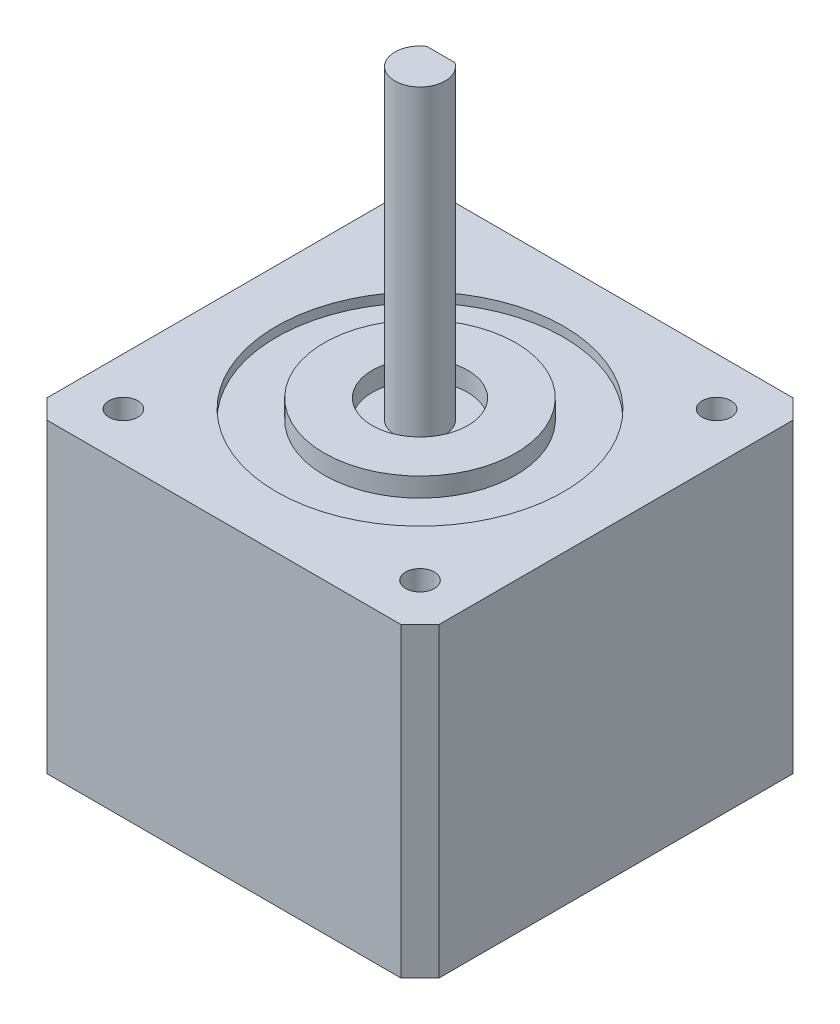
ISO-10303-21;
HEADER;
FILE_DESCRIPTION(('STEP AP214'),'2;1');
FILE_NAME('part.step','',(''),(''),'','','');
FILE_SCHEMA(('AUTOMOTIVE_DESIGN { 1 0 10303 214 1 1 1 1 }'));
ENDSEC;
DATA;
#1=APPLICATION_CONTEXT('core data for automotive mechanical design processes');
#2=APPLICATION_PROTOCOL_DEFINITION('international standard','automotive_design',2000,#1);
#3=PRODUCT_CONTEXT('',#1,'mechanical');
#4=PRODUCT('Part','Part','',(#3));
#5=PRODUCT_RELATED_PRODUCT_CATEGORY('part','',(#4));
#6=PRODUCT_DEFINITION_FORMATION('','',#4);
#7=PRODUCT_DEFINITION_CONTEXT('part definition',#1,'design');
#8=PRODUCT_DEFINITION('design','',#6,#7);
#9=PRODUCT_DEFINITION_SHAPE('','',#8);
#10=(LENGTH_UNIT() NAMED_UNIT(*) SI_UNIT(.MILLI.,.METRE.));
#11=(NAMED_UNIT(*) PLANE_ANGLE_UNIT() SI_UNIT($,.RADIAN.));
#12=(NAMED_UNIT(*) SI_UNIT($,.STERADIAN.) SOLID_ANGLE_UNIT());
#13=UNCERTAINTY_MEASURE_WITH_UNIT(LENGTH_MEASURE(1.E-05),#10,'distance_accuracy_value','');
#14=(GEOMETRIC_REPRESENTATION_CONTEXT(3) GLOBAL_UNCERTAINTY_ASSIGNED_CONTEXT((#13)) GLOBAL_UNIT_ASSIGNED_CONTEXT((#10,
#11,#12)) REPRESENTATION_CONTEXT('',''));
#15=CARTESIAN_POINT('',(0.,0.,0.));
#16=DIRECTION('',(0.,0.,1.));
#17=DIRECTION('',(1.,0.,0.));
#18=AXIS2_PLACEMENT_3D('',#15,#16,#17);
#19=CARTESIAN_POINT('',(0.,31.,0.));
#20=DIRECTION('',(0.,1.,0.));
#21=DIRECTION('',(0.,0.,1.));
#22=AXIS2_PLACEMENT_3D('',#19,#20,#21);
#23=PLANE('',#22);
#24=CARTESIAN_POINT('',(0.,31.,0.));
#25=DIRECTION('',(0.,1.,0.));
#26=DIRECTION('',(0.,0.,1.));
#27=AXIS2_PLACEMENT_3D('',#24,#25,#26);
#28=CIRCLE('',#27,5.);
#29=CARTESIAN_POINT('',(0.,31.,5.));
#30=VERTEX_POINT('',#29);
#31=EDGE_CURVE('E11',#30,#30,#28,.F.);
#32=ORIENTED_EDGE('',*,*,#31,.F.);
#33=EDGE_LOOP('',(#32));
#34=FACE_BOUND('',#33,.T.);
#35=DIRECTION('',(-1.,0.,0.));
#36=VECTOR('',#35,1.);
#37=CARTESIAN_POINT('',(-1.47098416147173,31.,-2.17535911633604));
#38=LINE('',#37,#36);
#39=CARTESIAN_POINT('',(1.47098416147173,31.,-2.17535911633604));
#40=VERTEX_POINT('',#39);
#41=CARTESIAN_POINT('',(-1.47098416147173,31.,-2.17535911633604));
#42=VERTEX_POINT('',#41);
#43=EDGE_CURVE('E214',#40,#42,#38,.T.);
#44=ORIENTED_EDGE('',*,*,#43,.F.);
#45=CARTESIAN_POINT('',(0.,31.,0.));
#46=DIRECTION('',(0.,1.,0.));
#47=DIRECTION('',(0.,0.,1.));
#48=AXIS2_PLACEMENT_3D('',#45,#46,#47);
#49=CIRCLE('',#48,2.62602012336673);
#50=EDGE_CURVE('E47',#42,#40,#49,.T.);
#51=ORIENTED_EDGE('',*,*,#50,.F.);
#52=EDGE_LOOP('',(#44,#51));
#53=FACE_BOUND('',#52,.T.);
#54=ADVANCED_FACE('F32',(#34,#53),#23,.T.);
#55=CARTESIAN_POINT('',(0.,31.,0.));
#56=DIRECTION('',(0.,1.,0.));
#57=DIRECTION('',(0.,0.,1.));
#58=AXIS2_PLACEMENT_3D('',#55,#56,#57);
#59=CIRCLE('',#58,15.);
#60=CARTESIAN_POINT('',(0.,31.,15.));
#61=VERTEX_POINT('',#60);
#62=EDGE_CURVE('E146',#61,#61,#59,.T.);
#63=ORIENTED_EDGE('',*,*,#62,.T.);
#64=EDGE_LOOP('',(#63));
#65=FACE_BOUND('',#64,.T.);
#66=CARTESIAN_POINT('',(0.,31.,0.));
#67=DIRECTION('',(0.,1.,0.));
#68=DIRECTION('',(0.,0.,1.));
#69=AXIS2_PLACEMENT_3D('',#66,#67,#68);
#70=CIRCLE('',#69,10.);
#71=CARTESIAN_POINT('',(0.,31.,10.));
#72=VERTEX_POINT('',#71);
#73=EDGE_CURVE('E201',#72,#72,#70,.T.);
#74=ORIENTED_EDGE('',*,*,#73,.F.);
#75=EDGE_LOOP('',(#74));
#76=FACE_BOUND('',#75,.T.);
#77=ADVANCED_FACE('F278',(#65,#76),#23,.T.);
#78=CARTESIAN_POINT('',(-18.5,32.,-20.5));
#79=DIRECTION('',(0.,0.,1.));
#80=DIRECTION('',(1.,0.,0.));
#81=AXIS2_PLACEMENT_3D('',#78,#79,#80);
#82=PLANE('',#81);
#83=DIRECTION('',(-1.,0.,0.));
#84=VECTOR('',#83,1.);
#85=CARTESIAN_POINT('',(-18.5,0.,-20.5));
#86=LINE('',#85,#84);
#87=CARTESIAN_POINT('',(18.5,0.,-20.5));
#88=VERTEX_POINT('',#87);
#89=CARTESIAN_POINT('',(-18.5,0.,-20.5));
#90=VERTEX_POINT('',#89);
#91=EDGE_CURVE('E142',#88,#90,#86,.T.);
#92=ORIENTED_EDGE('',*,*,#91,.T.);
#93=DIRECTION('',(0.,-1.,0.));
#94=VECTOR('',#93,1.);
#95=CARTESIAN_POINT('',(-18.5,32.,-20.5));
#96=LINE('',#95,#94);
#97=CARTESIAN_POINT('',(-18.5,32.,-20.5));
#98=VERTEX_POINT('',#97);
#99=EDGE_CURVE('E40',#98,#90,#96,.T.);
#100=ORIENTED_EDGE('',*,*,#99,.F.);
#101=DIRECTION('',(-1.,0.,0.));
#102=VECTOR('',#101,1.);
#103=CARTESIAN_POINT('',(-18.5,32.,-20.5));
#104=LINE('',#103,#102);
#105=CARTESIAN_POINT('',(18.5,32.,-20.5));
#106=VERTEX_POINT('',#105);
#107=EDGE_CURVE('E158',#106,#98,#104,.T.);
#108=ORIENTED_EDGE('',*,*,#107,.F.);
#109=DIRECTION('',(0.,-1.,0.));
#110=VECTOR('',#109,1.);
#111=CARTESIAN_POINT('',(18.5,32.,-20.5));
#112=LINE('',#111,#110);
#113=EDGE_CURVE('E138',#106,#88,#112,.T.);
#114=ORIENTED_EDGE('',*,*,#113,.T.);
#115=EDGE_LOOP('',(#92,#100,#108,#114));
#116=FACE_BOUND('',#115,.T.);
#117=ADVANCED_FACE('F34',(#116),#82,.F.);
#118=CARTESIAN_POINT('',(-20.5,32.,-18.5));
#119=DIRECTION('',(0.707106781186547,0.,0.707106781186548));
#120=DIRECTION('',(0.707106781186548,0.,-0.707106781186547));
#121=AXIS2_PLACEMENT_3D('',#118,#119,#120);
#122=PLANE('',#121);
#123=DIRECTION('',(-0.707106781186548,0.,0.707106781186547));
#124=VECTOR('',#123,1.);
#125=CARTESIAN_POINT('',(-20.5,0.,-18.5));
#126=LINE('',#125,#124);
#127=CARTESIAN_POINT('',(-20.5,0.,-18.5));
#128=VERTEX_POINT('',#127);
#129=EDGE_CURVE('E145',#90,#128,#126,.T.);
#130=ORIENTED_EDGE('',*,*,#129,.T.);
#131=DIRECTION('',(0.,-1.,0.));
#132=VECTOR('',#131,1.);
#133=CARTESIAN_POINT('',(-20.5,32.,-18.5));
#134=LINE('',#133,#132);
#135=CARTESIAN_POINT('',(-20.5,32.,-18.5));
#136=VERTEX_POINT('',#135);
#137=EDGE_CURVE('E168',#136,#128,#134,.T.);
#138=ORIENTED_EDGE('',*,*,#137,.F.);
#139=DIRECTION('',(-0.707106781186548,0.,0.707106781186547));
#140=VECTOR('',#139,1.);
#141=CARTESIAN_POINT('',(-20.5,32.,-18.5));
#142=LINE('',#141,#140);
#143=EDGE_CURVE('E98',#98,#136,#142,.T.);
#144=ORIENTED_EDGE('',*,*,#143,.F.);
#145=ORIENTED_EDGE('',*,*,#99,.T.);
#146=EDGE_LOOP('',(#130,#138,#144,#145));
#147=FACE_BOUND('',#146,.T.);
#148=ADVANCED_FACE('F171',(#147),#122,.F.);
#149=CARTESIAN_POINT('',(-20.5,32.,18.5));
#150=DIRECTION('',(1.,0.,0.));
#151=DIRECTION('',(0.,0.,-1.));
#152=AXIS2_PLACEMENT_3D('',#149,#150,#151);
#153=PLANE('',#152);
#154=DIRECTION('',(0.,0.,1.));
#155=VECTOR('',#154,1.);
#156=CARTESIAN_POINT('',(-20.5,0.,18.5));
#157=LINE('',#156,#155);
#158=CARTESIAN_POINT('',(-20.5,0.,18.5));
#159=VERTEX_POINT('',#158);
#160=EDGE_CURVE('E148',#128,#159,#157,.T.);
#161=ORIENTED_EDGE('',*,*,#160,.T.);
#162=DIRECTION('',(0.,-1.,0.));
#163=VECTOR('',#162,1.);
#164=CARTESIAN_POINT('',(-20.5,32.,18.5));
#165=LINE('',#164,#163);
#166=CARTESIAN_POINT('',(-20.5,32.,18.5));
#167=VERTEX_POINT('',#166);
#168=EDGE_CURVE('E165',#167,#159,#165,.T.);
#169=ORIENTED_EDGE('',*,*,#168,.F.);
#170=DIRECTION('',(0.,0.,1.));
#171=VECTOR('',#170,1.);
#172=CARTESIAN_POINT('',(-20.5,32.,18.5));
#173=LINE('',#172,#171);
#174=EDGE_CURVE('E189',#136,#167,#173,.T.);
#175=ORIENTED_EDGE('',*,*,#174,.F.);
#176=ORIENTED_EDGE('',*,*,#137,.T.);
#177=EDGE_LOOP('',(#161,#169,#175,#176));
#178=FACE_BOUND('',#177,.T.);
#179=ADVANCED_FACE('F182',(#178),#153,.F.);
#180=CARTESIAN_POINT('',(-18.5,32.,20.5));
#181=DIRECTION('',(0.707106781186547,0.,-0.707106781186548));
#182=DIRECTION('',(-0.707106781186548,0.,-0.707106781186547));
#183=AXIS2_PLACEMENT_3D('',#180,#181,#182);
#184=PLANE('',#183);
#185=DIRECTION('',(0.707106781186548,0.,0.707106781186547));
#186=VECTOR('',#185,1.);
#187=CARTESIAN_POINT('',(-18.5,0.,20.5));
#188=LINE('',#187,#186);
#189=CARTESIAN_POINT('',(-18.5,0.,20.5));
#190=VERTEX_POINT('',#189);
#191=EDGE_CURVE('E150',#159,#190,#188,.T.);
#192=ORIENTED_EDGE('',*,*,#191,.T.);
#193=DIRECTION('',(0.,-1.,0.));
#194=VECTOR('',#193,1.);
#195=CARTESIAN_POINT('',(-18.5,32.,20.5));
#196=LINE('',#195,#194);
#197=CARTESIAN_POINT('',(-18.5,32.,20.5));
#198=VERTEX_POINT('',#197);
#199=EDGE_CURVE('E162',#198,#190,#196,.T.);
#200=ORIENTED_EDGE('',*,*,#199,.F.);
#201=DIRECTION('',(0.707106781186548,0.,0.707106781186547));
#202=VECTOR('',#201,1.);
#203=CARTESIAN_POINT('',(-18.5,32.,20.5));
#204=LINE('',#203,#202);
#205=EDGE_CURVE('E188',#167,#198,#204,.T.);
#206=ORIENTED_EDGE('',*,*,#205,.F.);
#207=ORIENTED_EDGE('',*,*,#168,.T.);
#208=EDGE_LOOP('',(#192,#200,#206,#207));
#209=FACE_BOUND('',#208,.T.);
#210=ADVANCED_FACE('F186',(#209),#184,.F.);
#211=CARTESIAN_POINT('',(-18.5,32.,20.5));
#212=DIRECTION('',(0.,0.,-1.));
#213=DIRECTION('',(-1.,0.,0.));
#214=AXIS2_PLACEMENT_3D('',#211,#212,#213);
#215=PLANE('',#214);
#216=DIRECTION('',(1.,0.,0.));
#217=VECTOR('',#216,1.);
#218=CARTESIAN_POINT('',(-18.5,0.,20.5));
#219=LINE('',#218,#217);
#220=CARTESIAN_POINT('',(18.5,0.,20.5));
#221=VERTEX_POINT('',#220);
#222=EDGE_CURVE('E152',#190,#221,#219,.T.);
#223=ORIENTED_EDGE('',*,*,#222,.T.);
#224=DIRECTION('',(0.,-1.,0.));
#225=VECTOR('',#224,1.);
#226=CARTESIAN_POINT('',(18.5,32.,20.5));
#227=LINE('',#226,#225);
#228=CARTESIAN_POINT('',(18.5,32.,20.5));
#229=VERTEX_POINT('',#228);
#230=EDGE_CURVE('E133',#229,#221,#227,.T.);
#231=ORIENTED_EDGE('',*,*,#230,.F.);
#232=DIRECTION('',(1.,0.,0.));
#233=VECTOR('',#232,1.);
#234=CARTESIAN_POINT('',(-18.5,32.,20.5));
#235=LINE('',#234,#233);
#236=EDGE_CURVE('E121',#198,#229,#235,.T.);
#237=ORIENTED_EDGE('',*,*,#236,.F.);
#238=ORIENTED_EDGE('',*,*,#199,.T.);
#239=EDGE_LOOP('',(#223,#231,#237,#238));
#240=FACE_BOUND('',#239,.T.);
#241=ADVANCED_FACE('F435',(#240),#215,.F.);
#242=CARTESIAN_POINT('',(18.5,32.,20.5));
#243=DIRECTION('',(-0.707106781186547,0.,-0.707106781186548));
#244=DIRECTION('',(-0.707106781186548,0.,0.707106781186547));
#245=AXIS2_PLACEMENT_3D('',#242,#243,#244);
#246=PLANE('',#245);
#247=DIRECTION('',(0.707106781186548,0.,-0.707106781186547));
#248=VECTOR('',#247,1.);
#249=CARTESIAN_POINT('',(18.5,0.,20.5));
#250=LINE('',#249,#248);
#251=CARTESIAN_POINT('',(20.5,0.,18.5));
#252=VERTEX_POINT('',#251);
#253=EDGE_CURVE('E130',#221,#252,#250,.T.);
#254=ORIENTED_EDGE('',*,*,#253,.T.);
#255=DIRECTION('',(0.,-1.,0.));
#256=VECTOR('',#255,1.);
#257=CARTESIAN_POINT('',(20.5,32.,18.5));
#258=LINE('',#257,#256);
#259=CARTESIAN_POINT('',(20.5,32.,18.5));
#260=VERTEX_POINT('',#259);
#261=EDGE_CURVE('E127',#260,#252,#258,.T.);
#262=ORIENTED_EDGE('',*,*,#261,.F.);
#263=DIRECTION('',(0.707106781186548,0.,-0.707106781186547));
#264=VECTOR('',#263,1.);
#265=CARTESIAN_POINT('',(18.5,32.,20.5));
#266=LINE('',#265,#264);
#267=EDGE_CURVE('E114',#229,#260,#266,.T.);
#268=ORIENTED_EDGE('',*,*,#267,.F.);
#269=ORIENTED_EDGE('',*,*,#230,.T.);
#270=EDGE_LOOP('',(#254,#262,#268,#269));
#271=FACE_BOUND('',#270,.T.);
#272=ADVANCED_FACE('F128',(#271),#246,.F.);
#273=CARTESIAN_POINT('',(20.5,32.,18.5));
#274=DIRECTION('',(-1.,0.,0.));
#275=DIRECTION('',(0.,0.,1.));
#276=AXIS2_PLACEMENT_3D('',#273,#274,#275);
#277=PLANE('',#276);
#278=DIRECTION('',(0.,0.,-1.));
#279=VECTOR('',#278,1.);
#280=CARTESIAN_POINT('',(20.5,0.,18.5));
#281=LINE('',#280,#279);
#282=CARTESIAN_POINT('',(20.5,0.,-18.5));
#283=VERTEX_POINT('',#282);
#284=EDGE_CURVE('E155',#252,#283,#281,.T.);
#285=ORIENTED_EDGE('',*,*,#284,.T.);
#286=DIRECTION('',(0.,-1.,0.));
#287=VECTOR('',#286,1.);
#288=CARTESIAN_POINT('',(20.5,32.,-18.5));
#289=LINE('',#288,#287);
#290=CARTESIAN_POINT('',(20.5,32.,-18.5));
#291=VERTEX_POINT('',#290);
#292=EDGE_CURVE('E134',#291,#283,#289,.T.);
#293=ORIENTED_EDGE('',*,*,#292,.F.);
#294=DIRECTION('',(0.,0.,-1.));
#295=VECTOR('',#294,1.);
#296=CARTESIAN_POINT('',(20.5,32.,18.5));
#297=LINE('',#296,#295);
#298=EDGE_CURVE('E118',#260,#291,#297,.T.);
#299=ORIENTED_EDGE('',*,*,#298,.F.);
#300=ORIENTED_EDGE('',*,*,#261,.T.);
#301=EDGE_LOOP('',(#285,#293,#299,#300));
#302=FACE_BOUND('',#301,.T.);
#303=ADVANCED_FACE('F136',(#302),#277,.F.);
#304=CARTESIAN_POINT('',(20.5,32.,-18.5));
#305=DIRECTION('',(-0.707106781186547,0.,0.707106781186547));
#306=DIRECTION('',(0.707106781186548,0.,0.707106781186548));
#307=AXIS2_PLACEMENT_3D('',#304,#305,#306);
#308=PLANE('',#307);
#309=DIRECTION('',(-0.707106781186547,0.,-0.707106781186547));
#310=VECTOR('',#309,1.);
#311=CARTESIAN_POINT('',(20.5,0.,-18.5));
#312=LINE('',#311,#310);
#313=EDGE_CURVE('E89',#283,#88,#312,.T.);
#314=ORIENTED_EDGE('',*,*,#313,.T.);
#315=ORIENTED_EDGE('',*,*,#113,.F.);
#316=DIRECTION('',(-0.707106781186547,0.,-0.707106781186547));
#317=VECTOR('',#316,1.);
#318=CARTESIAN_POINT('',(20.5,32.,-18.5));
#319=LINE('',#318,#317);
#320=EDGE_CURVE('E56',#291,#106,#319,.T.);
#321=ORIENTED_EDGE('',*,*,#320,.F.);
#322=ORIENTED_EDGE('',*,*,#292,.T.);
#323=EDGE_LOOP('',(#314,#315,#321,#322));
#324=FACE_BOUND('',#323,.T.);
#325=ADVANCED_FACE('F252',(#324),#308,.F.);
#326=CARTESIAN_POINT('',(20.5,32.,-20.5));
#327=DIRECTION('',(0.,1.,0.));
#328=DIRECTION('',(0.,0.,1.));
#329=AXIS2_PLACEMENT_3D('',#326,#327,#328);
#330=PLANE('',#329);
#331=CARTESIAN_POINT('',(15.5,32.,-15.5));
#332=DIRECTION('',(0.,1.,0.));
#333=DIRECTION('',(0.,0.,1.));
#334=AXIS2_PLACEMENT_3D('',#331,#332,#333);
#335=CIRCLE('',#334,1.5);
#336=CARTESIAN_POINT('',(15.5,32.,-14.));
#337=VERTEX_POINT('',#336);
#338=EDGE_CURVE('E244',#337,#337,#335,.T.);
#339=ORIENTED_EDGE('',*,*,#338,.F.);
#340=EDGE_LOOP('',(#339));
#341=FACE_BOUND('',#340,.T.);
#342=CARTESIAN_POINT('',(-15.5,32.,-15.5));
#343=DIRECTION('',(0.,1.,0.));
#344=DIRECTION('',(0.,0.,1.));
#345=AXIS2_PLACEMENT_3D('',#342,#343,#344);
#346=CIRCLE('',#345,1.5);
#347=CARTESIAN_POINT('',(-15.5,32.,-14.));
#348=VERTEX_POINT('',#347);
#349=EDGE_CURVE('E238',#348,#348,#346,.T.);
#350=ORIENTED_EDGE('',*,*,#349,.F.);
#351=EDGE_LOOP('',(#350));
#352=FACE_BOUND('',#351,.T.);
#353=CARTESIAN_POINT('',(-15.5,32.,15.5));
#354=DIRECTION('',(0.,1.,0.));
#355=DIRECTION('',(0.,0.,1.));
#356=AXIS2_PLACEMENT_3D('',#353,#354,#355);
#357=CIRCLE('',#356,1.5);
#358=CARTESIAN_POINT('',(-15.5,32.,17.));
#359=VERTEX_POINT('',#358);
#360=EDGE_CURVE('E232',#359,#359,#357,.T.);
#361=ORIENTED_EDGE('',*,*,#360,.F.);
#362=EDGE_LOOP('',(#361));
#363=FACE_BOUND('',#362,.T.);
#364=CARTESIAN_POINT('',(15.5,32.,15.5));
#365=DIRECTION('',(0.,1.,0.));
#366=DIRECTION('',(0.,0.,1.));
#367=AXIS2_PLACEMENT_3D('',#364,#365,#366);
#368=CIRCLE('',#367,1.5);
#369=CARTESIAN_POINT('',(15.5,32.,17.));
#370=VERTEX_POINT('',#369);
#371=EDGE_CURVE('E226',#370,#370,#368,.T.);
#372=ORIENTED_EDGE('',*,*,#371,.F.);
#373=EDGE_LOOP('',(#372));
#374=FACE_BOUND('',#373,.T.);
#375=CARTESIAN_POINT('',(0.,32.,0.));
#376=DIRECTION('',(0.,1.,0.));
#377=DIRECTION('',(0.,0.,1.));
#378=AXIS2_PLACEMENT_3D('',#375,#376,#377);
#379=CIRCLE('',#378,15.);
#380=CARTESIAN_POINT('',(0.,32.,15.));
#381=VERTEX_POINT('',#380);
#382=EDGE_CURVE('E195',#381,#381,#379,.T.);
#383=ORIENTED_EDGE('',*,*,#382,.F.);
#384=EDGE_LOOP('',(#383));
#385=FACE_BOUND('',#384,.T.);
#386=ORIENTED_EDGE('',*,*,#107,.T.);
#387=ORIENTED_EDGE('',*,*,#143,.T.);
#388=ORIENTED_EDGE('',*,*,#174,.T.);
#389=ORIENTED_EDGE('',*,*,#205,.T.);
#390=ORIENTED_EDGE('',*,*,#236,.T.);
#391=ORIENTED_EDGE('',*,*,#267,.T.);
#392=ORIENTED_EDGE('',*,*,#298,.T.);
#393=ORIENTED_EDGE('',*,*,#320,.T.);
#394=EDGE_LOOP('',(#386,#387,#388,#389,#390,#391,#392,#393));
#395=FACE_BOUND('',#394,.T.);
#396=ADVANCED_FACE('F116',(#341,#352,#363,#374,#385,#395),#330,.T.);
#397=CARTESIAN_POINT('',(20.5,0.,-20.5));
#398=DIRECTION('',(0.,1.,0.));
#399=DIRECTION('',(0.,0.,1.));
#400=AXIS2_PLACEMENT_3D('',#397,#398,#399);
#401=PLANE('',#400);
#402=ORIENTED_EDGE('',*,*,#91,.F.);
#403=ORIENTED_EDGE('',*,*,#313,.F.);
#404=ORIENTED_EDGE('',*,*,#284,.F.);
#405=ORIENTED_EDGE('',*,*,#253,.F.);
#406=ORIENTED_EDGE('',*,*,#222,.F.);
#407=ORIENTED_EDGE('',*,*,#191,.F.);
#408=ORIENTED_EDGE('',*,*,#160,.F.);
#409=ORIENTED_EDGE('',*,*,#129,.F.);
#410=EDGE_LOOP('',(#402,#403,#404,#405,#406,#407,#408,#409));
#411=FACE_BOUND('',#410,.T.);
#412=ADVANCED_FACE('F176',(#411),#401,.F.);
#413=CARTESIAN_POINT('',(0.,31.,0.));
#414=DIRECTION('',(0.,1.,0.));
#415=DIRECTION('',(0.,0.,1.));
#416=AXIS2_PLACEMENT_3D('',#413,#414,#415);
#417=CYLINDRICAL_SURFACE('',#416,15.);
#418=ORIENTED_EDGE('',*,*,#62,.F.);
#419=EDGE_LOOP('',(#418));
#420=FACE_BOUND('',#419,.T.);
#421=ORIENTED_EDGE('',*,*,#382,.T.);
#422=EDGE_LOOP('',(#421));
#423=FACE_BOUND('',#422,.T.);
#424=ADVANCED_FACE('F262',(#420,#423),#417,.F.);
#425=CARTESIAN_POINT('',(0.,33.,0.));
#426=DIRECTION('',(0.,1.,0.));
#427=DIRECTION('',(0.,0.,1.));
#428=AXIS2_PLACEMENT_3D('',#425,#426,#427);
#429=PLANE('',#428);
#430=CARTESIAN_POINT('',(0.,33.,0.));
#431=DIRECTION('',(0.,1.,0.));
#432=DIRECTION('',(0.,0.,1.));
#433=AXIS2_PLACEMENT_3D('',#430,#431,#432);
#434=CIRCLE('',#433,10.);
#435=CARTESIAN_POINT('',(0.,33.,10.));
#436=VERTEX_POINT('',#435);
#437=EDGE_CURVE('E198',#436,#436,#434,.T.);
#438=ORIENTED_EDGE('',*,*,#437,.T.);
#439=EDGE_LOOP('',(#438));
#440=FACE_BOUND('',#439,.T.);
#441=CARTESIAN_POINT('',(0.,33.,0.));
#442=DIRECTION('',(0.,1.,0.));
#443=DIRECTION('',(0.,0.,1.));
#444=AXIS2_PLACEMENT_3D('',#441,#442,#443);
#445=CIRCLE('',#444,5.);
#446=CARTESIAN_POINT('',(0.,33.,5.));
#447=VERTEX_POINT('',#446);
#448=EDGE_CURVE('E204',#447,#447,#445,.T.);
#449=ORIENTED_EDGE('',*,*,#448,.F.);
#450=EDGE_LOOP('',(#449));
#451=FACE_BOUND('',#450,.T.);
#452=ADVANCED_FACE('F264',(#440,#451),#429,.T.);
#453=CARTESIAN_POINT('',(0.,33.,0.));
#454=DIRECTION('',(0.,-1.,0.));
#455=DIRECTION('',(0.,0.,-1.));
#456=AXIS2_PLACEMENT_3D('',#453,#454,#455);
#457=CYLINDRICAL_SURFACE('',#456,10.);
#458=ORIENTED_EDGE('',*,*,#437,.F.);
#459=EDGE_LOOP('',(#458));
#460=FACE_BOUND('',#459,.T.);
#461=ORIENTED_EDGE('',*,*,#73,.T.);
#462=EDGE_LOOP('',(#461));
#463=FACE_BOUND('',#462,.T.);
#464=ADVANCED_FACE('F271',(#460,#463),#457,.T.);
#465=CARTESIAN_POINT('',(0.,33.,0.));
#466=DIRECTION('',(0.,-1.,0.));
#467=DIRECTION('',(0.,0.,-1.));
#468=AXIS2_PLACEMENT_3D('',#465,#466,#467);
#469=CYLINDRICAL_SURFACE('',#468,5.);
#470=ORIENTED_EDGE('',*,*,#448,.T.);
#471=EDGE_LOOP('',(#470));
#472=FACE_BOUND('',#471,.T.);
#473=ORIENTED_EDGE('',*,*,#31,.T.);
#474=EDGE_LOOP('',(#473));
#475=FACE_BOUND('',#474,.T.);
#476=ADVANCED_FACE('F288',(#472,#475),#469,.F.);
#477=CARTESIAN_POINT('',(0.,63.,0.));
#478=DIRECTION('',(0.,-1.,0.));
#479=DIRECTION('',(0.,0.,-1.));
#480=AXIS2_PLACEMENT_3D('',#477,#478,#479);
#481=CYLINDRICAL_SURFACE('',#480,2.62602012336673);
#482=ORIENTED_EDGE('',*,*,#50,.T.);
#483=DIRECTION('',(0.,-1.,0.));
#484=VECTOR('',#483,1.);
#485=CARTESIAN_POINT('',(1.47098416147173,63.,-2.17535911633604));
#486=LINE('',#485,#484);
#487=CARTESIAN_POINT('',(1.47098416147173,63.,-2.17535911633604));
#488=VERTEX_POINT('',#487);
#489=EDGE_CURVE('E209',#488,#40,#486,.T.);
#490=ORIENTED_EDGE('',*,*,#489,.F.);
#491=CARTESIAN_POINT('',(0.,63.,0.));
#492=DIRECTION('',(0.,1.,0.));
#493=DIRECTION('',(0.,0.,1.));
#494=AXIS2_PLACEMENT_3D('',#491,#492,#493);
#495=CIRCLE('',#494,2.62602012336673);
#496=CARTESIAN_POINT('',(-1.47098416147173,63.,-2.17535911633604));
#497=VERTEX_POINT('',#496);
#498=EDGE_CURVE('E217',#497,#488,#495,.T.);
#499=ORIENTED_EDGE('',*,*,#498,.F.);
#500=DIRECTION('',(0.,-1.,0.));
#501=VECTOR('',#500,1.);
#502=CARTESIAN_POINT('',(-1.47098416147173,63.,-2.17535911633604));
#503=LINE('',#502,#501);
#504=EDGE_CURVE('E211',#497,#42,#503,.T.);
#505=ORIENTED_EDGE('',*,*,#504,.T.);
#506=EDGE_LOOP('',(#482,#490,#499,#505));
#507=FACE_BOUND('',#506,.T.);
#508=ADVANCED_FACE('F293',(#507),#481,.T.);
#509=CARTESIAN_POINT('',(-1.47098416147173,63.,-2.17535911633604));
#510=DIRECTION('',(0.,0.,1.));
#511=DIRECTION('',(1.,0.,0.));
#512=AXIS2_PLACEMENT_3D('',#509,#510,#511);
#513=PLANE('',#512);
#514=ORIENTED_EDGE('',*,*,#43,.T.);
#515=ORIENTED_EDGE('',*,*,#504,.F.);
#516=DIRECTION('',(-1.,0.,0.));
#517=VECTOR('',#516,1.);
#518=CARTESIAN_POINT('',(-1.47098416147173,63.,-2.17535911633604));
#519=LINE('',#518,#517);
#520=EDGE_CURVE('E213',#488,#497,#519,.T.);
#521=ORIENTED_EDGE('',*,*,#520,.F.);
#522=ORIENTED_EDGE('',*,*,#489,.T.);
#523=EDGE_LOOP('',(#514,#515,#521,#522));
#524=FACE_BOUND('',#523,.T.);
#525=ADVANCED_FACE('F297',(#524),#513,.F.);
#526=CARTESIAN_POINT('',(0.,63.,0.));
#527=DIRECTION('',(0.,1.,0.));
#528=DIRECTION('',(0.,0.,1.));
#529=AXIS2_PLACEMENT_3D('',#526,#527,#528);
#530=PLANE('',#529);
#531=ORIENTED_EDGE('',*,*,#498,.T.);
#532=ORIENTED_EDGE('',*,*,#520,.T.);
#533=EDGE_LOOP('',(#531,#532));
#534=FACE_BOUND('',#533,.T.);
#535=ADVANCED_FACE('F300',(#534),#530,.T.);
#536=CARTESIAN_POINT('',(15.5,27.,15.5));
#537=DIRECTION('',(0.,1.,0.));
#538=DIRECTION('',(0.,0.,1.));
#539=AXIS2_PLACEMENT_3D('',#536,#537,#538);
#540=CONICAL_SURFACE('',#539,1.5,1.02974425867665);
#541=CARTESIAN_POINT('',(15.5,26.0987090714587,15.5));
#542=VERTEX_POINT('',#541);
#543=VERTEX_LOOP('',#542);
#544=FACE_BOUND('',#543,.T.);
#545=CARTESIAN_POINT('',(15.5,27.,15.5));
#546=DIRECTION('',(0.,1.,0.));
#547=DIRECTION('',(0.,0.,1.));
#548=AXIS2_PLACEMENT_3D('',#545,#546,#547);
#549=CIRCLE('',#548,1.5);
#550=CARTESIAN_POINT('',(15.5,27.,17.));
#551=VERTEX_POINT('',#550);
#552=EDGE_CURVE('E219',#551,#551,#549,.T.);
#553=ORIENTED_EDGE('',*,*,#552,.T.);
#554=EDGE_LOOP('',(#553));
#555=FACE_BOUND('',#554,.T.);
#556=ADVANCED_FACE('F304',(#544,#555),#540,.F.);
#557=CARTESIAN_POINT('',(15.5,32.,15.5));
#558=DIRECTION('',(0.,1.,0.));
#559=DIRECTION('',(0.,0.,1.));
#560=AXIS2_PLACEMENT_3D('',#557,#558,#559);
#561=CYLINDRICAL_SURFACE('',#560,1.5);
#562=ORIENTED_EDGE('',*,*,#552,.F.);
#563=EDGE_LOOP('',(#562));
#564=FACE_BOUND('',#563,.T.);
#565=ORIENTED_EDGE('',*,*,#371,.T.);
#566=EDGE_LOOP('',(#565));
#567=FACE_BOUND('',#566,.T.);
#568=ADVANCED_FACE('F308',(#564,#567),#561,.F.);
#569=CARTESIAN_POINT('',(-15.5,27.,15.5));
#570=DIRECTION('',(0.,1.,0.));
#571=DIRECTION('',(0.,0.,1.));
#572=AXIS2_PLACEMENT_3D('',#569,#570,#571);
#573=CONICAL_SURFACE('',#572,1.5,1.02974425867665);
#574=CARTESIAN_POINT('',(-15.5,26.0987090714587,15.5));
#575=VERTEX_POINT('',#574);
#576=VERTEX_LOOP('',#575);
#577=FACE_BOUND('',#576,.T.);
#578=CARTESIAN_POINT('',(-15.5,27.,15.5));
#579=DIRECTION('',(0.,1.,0.));
#580=DIRECTION('',(0.,0.,1.));
#581=AXIS2_PLACEMENT_3D('',#578,#579,#580);
#582=CIRCLE('',#581,1.5);
#583=CARTESIAN_POINT('',(-15.5,27.,17.));
#584=VERTEX_POINT('',#583);
#585=EDGE_CURVE('E229',#584,#584,#582,.T.);
#586=ORIENTED_EDGE('',*,*,#585,.T.);
#587=EDGE_LOOP('',(#586));
#588=FACE_BOUND('',#587,.T.);
#589=ADVANCED_FACE('F312',(#577,#588),#573,.F.);
#590=CARTESIAN_POINT('',(-15.5,32.,15.5));
#591=DIRECTION('',(0.,1.,0.));
#592=DIRECTION('',(0.,0.,1.));
#593=AXIS2_PLACEMENT_3D('',#590,#591,#592);
#594=CYLINDRICAL_SURFACE('',#593,1.5);
#595=ORIENTED_EDGE('',*,*,#585,.F.);
#596=EDGE_LOOP('',(#595));
#597=FACE_BOUND('',#596,.T.);
#598=ORIENTED_EDGE('',*,*,#360,.T.);
#599=EDGE_LOOP('',(#598));
#600=FACE_BOUND('',#599,.T.);
#601=ADVANCED_FACE('F316',(#597,#600),#594,.F.);
#602=CARTESIAN_POINT('',(-15.5,27.,-15.5));
#603=DIRECTION('',(0.,1.,0.));
#604=DIRECTION('',(0.,0.,1.));
#605=AXIS2_PLACEMENT_3D('',#602,#603,#604);
#606=CONICAL_SURFACE('',#605,1.5,1.02974425867665);
#607=CARTESIAN_POINT('',(-15.5,26.0987090714587,-15.5));
#608=VERTEX_POINT('',#607);
#609=VERTEX_LOOP('',#608);
#610=FACE_BOUND('',#609,.T.);
#611=CARTESIAN_POINT('',(-15.5,27.,-15.5));
#612=DIRECTION('',(0.,1.,0.));
#613=DIRECTION('',(0.,0.,1.));
#614=AXIS2_PLACEMENT_3D('',#611,#612,#613);
#615=CIRCLE('',#614,1.5);
#616=CARTESIAN_POINT('',(-15.5,27.,-14.));
#617=VERTEX_POINT('',#616);
#618=EDGE_CURVE('E235',#617,#617,#615,.T.);
#619=ORIENTED_EDGE('',*,*,#618,.T.);
#620=EDGE_LOOP('',(#619));
#621=FACE_BOUND('',#620,.T.);
#622=ADVANCED_FACE('F320',(#610,#621),#606,.F.);
#623=CARTESIAN_POINT('',(-15.5,32.,-15.5));
#624=DIRECTION('',(0.,1.,0.));
#625=DIRECTION('',(0.,0.,1.));
#626=AXIS2_PLACEMENT_3D('',#623,#624,#625);
#627=CYLINDRICAL_SURFACE('',#626,1.5);
#628=ORIENTED_EDGE('',*,*,#618,.F.);
#629=EDGE_LOOP('',(#628));
#630=FACE_BOUND('',#629,.T.);
#631=ORIENTED_EDGE('',*,*,#349,.T.);
#632=EDGE_LOOP('',(#631));
#633=FACE_BOUND('',#632,.T.);
#634=ADVANCED_FACE('F324',(#630,#633),#627,.F.);
#635=CARTESIAN_POINT('',(15.5,27.,-15.5));
#636=DIRECTION('',(0.,1.,0.));
#637=DIRECTION('',(0.,0.,1.));
#638=AXIS2_PLACEMENT_3D('',#635,#636,#637);
#639=CONICAL_SURFACE('',#638,1.5,1.02974425867665);
#640=CARTESIAN_POINT('',(15.5,26.0987090714587,-15.5));
#641=VERTEX_POINT('',#640);
#642=VERTEX_LOOP('',#641);
#643=FACE_BOUND('',#642,.T.);
#644=CARTESIAN_POINT('',(15.5,27.,-15.5));
#645=DIRECTION('',(0.,1.,0.));
#646=DIRECTION('',(0.,0.,1.));
#647=AXIS2_PLACEMENT_3D('',#644,#645,#646);
#648=CIRCLE('',#647,1.5);
#649=CARTESIAN_POINT('',(15.5,27.,-14.));
#650=VERTEX_POINT('',#649);
#651=EDGE_CURVE('E241',#650,#650,#648,.T.);
#652=ORIENTED_EDGE('',*,*,#651,.T.);
#653=EDGE_LOOP('',(#652));
#654=FACE_BOUND('',#653,.T.);
#655=ADVANCED_FACE('F328',(#643,#654),#639,.F.);
#656=CARTESIAN_POINT('',(15.5,32.,-15.5));
#657=DIRECTION('',(0.,1.,0.));
#658=DIRECTION('',(0.,0.,1.));
#659=AXIS2_PLACEMENT_3D('',#656,#657,#658);
#660=CYLINDRICAL_SURFACE('',#659,1.5);
#661=ORIENTED_EDGE('',*,*,#651,.F.);
#662=EDGE_LOOP('',(#661));
#663=FACE_BOUND('',#662,.T.);
#664=ORIENTED_EDGE('',*,*,#338,.T.);
#665=EDGE_LOOP('',(#664));
#666=FACE_BOUND('',#665,.T.);
#667=ADVANCED_FACE('F248',(#663,#666),#660,.F.);
#668=CLOSED_SHELL('',(#54,#77,#117,#148,#179,#210,#241,#272,#303,#325,#396,#412,#424,#452,#464,
#476,#508,#525,#535,#556,#568,#589,#601,#622,#634,#655,#667));
#669=MANIFOLD_SOLID_BREP('B2',#668);
#670=ADVANCED_BREP_SHAPE_REPRESENTATION('',(#18,#669),#14);
#671=SHAPE_DEFINITION_REPRESENTATION(#9,#670);
ENDSEC;
END-ISO-10303-21;
